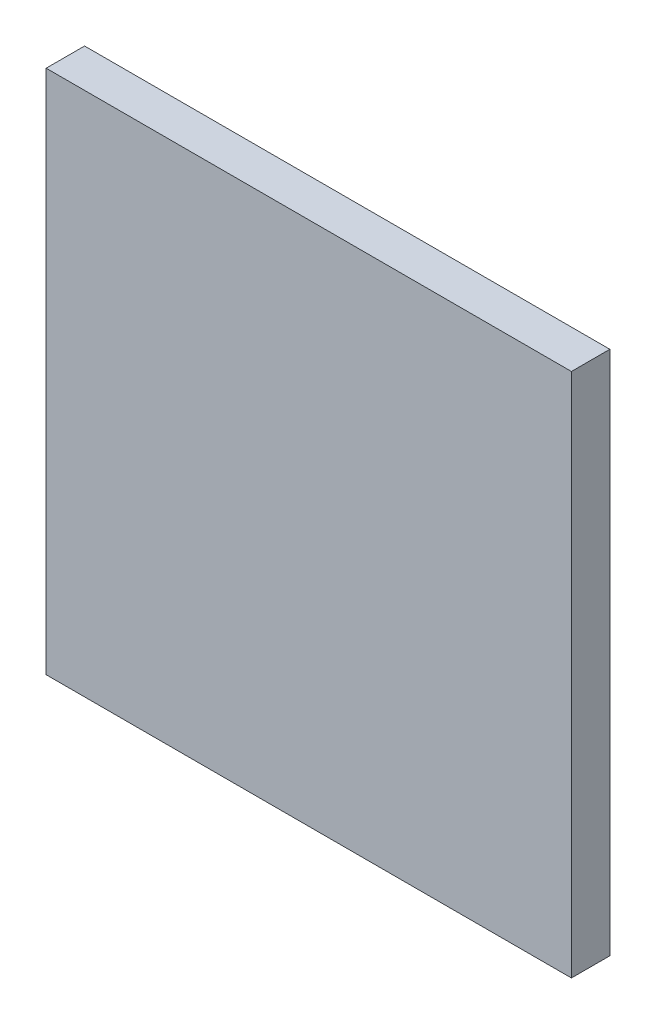
ISO-10303-21;
HEADER;
FILE_DESCRIPTION(('STEP AP214'),'2;1');
FILE_NAME('part.step','',(''),(''),'','','');
FILE_SCHEMA(('AUTOMOTIVE_DESIGN { 1 0 10303 214 1 1 1 1 }'));
ENDSEC;
DATA;
#1=APPLICATION_CONTEXT('core data for automotive mechanical design processes');
#2=APPLICATION_PROTOCOL_DEFINITION('international standard','automotive_design',2000,#1);
#3=PRODUCT_CONTEXT('',#1,'mechanical');
#4=PRODUCT('Part','Part','',(#3));
#5=PRODUCT_RELATED_PRODUCT_CATEGORY('part','',(#4));
#6=PRODUCT_DEFINITION_FORMATION('','',#4);
#7=PRODUCT_DEFINITION_CONTEXT('part definition',#1,'design');
#8=PRODUCT_DEFINITION('design','',#6,#7);
#9=PRODUCT_DEFINITION_SHAPE('','',#8);
#10=(LENGTH_UNIT() NAMED_UNIT(*) SI_UNIT(.MILLI.,.METRE.));
#11=(NAMED_UNIT(*) PLANE_ANGLE_UNIT() SI_UNIT($,.RADIAN.));
#12=(NAMED_UNIT(*) SI_UNIT($,.STERADIAN.) SOLID_ANGLE_UNIT());
#13=UNCERTAINTY_MEASURE_WITH_UNIT(LENGTH_MEASURE(1.E-05),#10,'distance_accuracy_value','');
#14=(GEOMETRIC_REPRESENTATION_CONTEXT(3) GLOBAL_UNCERTAINTY_ASSIGNED_CONTEXT((#13)) GLOBAL_UNIT_ASSIGNED_CONTEXT((#10,
#11,#12)) REPRESENTATION_CONTEXT('',''));
#15=CARTESIAN_POINT('',(0.,0.,0.));
#16=DIRECTION('',(0.,0.,1.));
#17=DIRECTION('',(1.,0.,0.));
#18=AXIS2_PLACEMENT_3D('',#15,#16,#17);
#19=CARTESIAN_POINT('',(0.,0.,0.));
#20=DIRECTION('',(0.,0.,1.));
#21=DIRECTION('',(1.,0.,0.));
#22=AXIS2_PLACEMENT_3D('',#19,#20,#21);
#23=PLANE('',#22);
#24=DIRECTION('',(0.,-1.,0.));
#25=VECTOR('',#24,1.);
#26=CARTESIAN_POINT('',(-154.745728399638,93.3447432762836,0.));
#27=LINE('',#26,#25);
#28=CARTESIAN_POINT('',(-154.745728399638,93.3447432762836,0.));
#29=VERTEX_POINT('',#28);
#30=CARTESIAN_POINT('',(-154.745728399638,-70.6552567237164,0.));
#31=VERTEX_POINT('',#30);
#32=EDGE_CURVE('E143',#29,#31,#27,.T.);
#33=ORIENTED_EDGE('',*,*,#32,.F.);
#34=DIRECTION('',(-1.,0.,0.));
#35=VECTOR('',#34,1.);
#36=CARTESIAN_POINT('',(-154.745728399638,93.3447432762836,0.));
#37=LINE('',#36,#35);
#38=CARTESIAN_POINT('',(9.2542716003621,93.3447432762836,0.));
#39=VERTEX_POINT('',#38);
#40=EDGE_CURVE('E91',#39,#29,#37,.T.);
#41=ORIENTED_EDGE('',*,*,#40,.F.);
#42=DIRECTION('',(0.,1.,0.));
#43=VECTOR('',#42,1.);
#44=CARTESIAN_POINT('',(9.2542716003621,93.3447432762836,0.));
#45=LINE('',#44,#43);
#46=CARTESIAN_POINT('',(9.25427160036213,-70.6552567237164,0.));
#47=VERTEX_POINT('',#46);
#48=EDGE_CURVE('E168',#47,#39,#45,.T.);
#49=ORIENTED_EDGE('',*,*,#48,.F.);
#50=DIRECTION('',(1.,0.,0.));
#51=VECTOR('',#50,1.);
#52=CARTESIAN_POINT('',(-154.745728399638,-70.6552567237164,0.));
#53=LINE('',#52,#51);
#54=EDGE_CURVE('E149',#31,#47,#53,.T.);
#55=ORIENTED_EDGE('',*,*,#54,.F.);
#56=EDGE_LOOP('',(#33,#41,#49,#55));
#57=FACE_BOUND('',#56,.T.);
#58=DIRECTION('',(0.,-1.,0.));
#59=VECTOR('',#58,1.);
#60=CARTESIAN_POINT('',(-152.745728399638,91.3447432762836,0.));
#61=LINE('',#60,#59);
#62=CARTESIAN_POINT('',(-152.745728399638,91.3447432762836,0.));
#63=VERTEX_POINT('',#62);
#64=CARTESIAN_POINT('',(-152.745728399638,-68.6552567237164,0.));
#65=VERTEX_POINT('',#64);
#66=EDGE_CURVE('E61',#63,#65,#61,.T.);
#67=ORIENTED_EDGE('',*,*,#66,.T.);
#68=DIRECTION('',(1.,0.,0.));
#69=VECTOR('',#68,1.);
#70=CARTESIAN_POINT('',(-152.745728399638,-68.6552567237164,0.));
#71=LINE('',#70,#69);
#72=CARTESIAN_POINT('',(7.25427160036213,-68.6552567237164,0.));
#73=VERTEX_POINT('',#72);
#74=EDGE_CURVE('E141',#65,#73,#71,.T.);
#75=ORIENTED_EDGE('',*,*,#74,.T.);
#76=DIRECTION('',(0.,1.,0.));
#77=VECTOR('',#76,1.);
#78=CARTESIAN_POINT('',(7.2542716003621,91.3447432762836,0.));
#79=LINE('',#78,#77);
#80=CARTESIAN_POINT('',(7.2542716003621,91.3447432762836,0.));
#81=VERTEX_POINT('',#80);
#82=EDGE_CURVE('E316',#73,#81,#79,.T.);
#83=ORIENTED_EDGE('',*,*,#82,.T.);
#84=DIRECTION('',(-1.,0.,0.));
#85=VECTOR('',#84,1.);
#86=CARTESIAN_POINT('',(-152.745728399638,91.3447432762836,0.));
#87=LINE('',#86,#85);
#88=EDGE_CURVE('E137',#81,#63,#87,.T.);
#89=ORIENTED_EDGE('',*,*,#88,.T.);
#90=EDGE_LOOP('',(#67,#75,#83,#89));
#91=FACE_BOUND('',#90,.T.);
#92=ADVANCED_FACE('F45',(#57,#91),#23,.F.);
#93=CARTESIAN_POINT('',(-154.745728399638,93.3447432762836,12.));
#94=DIRECTION('',(1.,0.,0.));
#95=DIRECTION('',(0.,1.,0.));
#96=AXIS2_PLACEMENT_3D('',#93,#94,#95);
#97=PLANE('',#96);
#98=ORIENTED_EDGE('',*,*,#32,.T.);
#99=DIRECTION('',(0.,0.,-1.));
#100=VECTOR('',#99,1.);
#101=CARTESIAN_POINT('',(-154.745728399638,-70.6552567237164,12.));
#102=LINE('',#101,#100);
#103=CARTESIAN_POINT('',(-154.745728399638,-70.6552567237164,12.));
#104=VERTEX_POINT('',#103);
#105=EDGE_CURVE('E11',#104,#31,#102,.T.);
#106=ORIENTED_EDGE('',*,*,#105,.F.);
#107=DIRECTION('',(0.,-1.,0.));
#108=VECTOR('',#107,1.);
#109=CARTESIAN_POINT('',(-154.745728399638,93.3447432762836,12.));
#110=LINE('',#109,#108);
#111=CARTESIAN_POINT('',(-154.745728399638,93.3447432762836,12.));
#112=VERTEX_POINT('',#111);
#113=EDGE_CURVE('E155',#112,#104,#110,.T.);
#114=ORIENTED_EDGE('',*,*,#113,.F.);
#115=DIRECTION('',(0.,0.,-1.));
#116=VECTOR('',#115,1.);
#117=CARTESIAN_POINT('',(-154.745728399638,93.3447432762836,12.));
#118=LINE('',#117,#116);
#119=EDGE_CURVE('E164',#112,#29,#118,.T.);
#120=ORIENTED_EDGE('',*,*,#119,.T.);
#121=EDGE_LOOP('',(#98,#106,#114,#120));
#122=FACE_BOUND('',#121,.T.);
#123=ADVANCED_FACE('F47',(#122),#97,.F.);
#124=CARTESIAN_POINT('',(-154.745728399638,-70.6552567237164,12.));
#125=DIRECTION('',(0.,1.,0.));
#126=DIRECTION('',(0.,0.,1.));
#127=AXIS2_PLACEMENT_3D('',#124,#125,#126);
#128=PLANE('',#127);
#129=ORIENTED_EDGE('',*,*,#54,.T.);
#130=DIRECTION('',(0.,0.,-1.));
#131=VECTOR('',#130,1.);
#132=CARTESIAN_POINT('',(9.25427160036213,-70.6552567237164,12.));
#133=LINE('',#132,#131);
#134=CARTESIAN_POINT('',(9.25427160036213,-70.6552567237164,12.));
#135=VERTEX_POINT('',#134);
#136=EDGE_CURVE('E54',#135,#47,#133,.T.);
#137=ORIENTED_EDGE('',*,*,#136,.F.);
#138=DIRECTION('',(1.,0.,0.));
#139=VECTOR('',#138,1.);
#140=CARTESIAN_POINT('',(-154.745728399638,-70.6552567237164,12.));
#141=LINE('',#140,#139);
#142=EDGE_CURVE('E98',#104,#135,#141,.T.);
#143=ORIENTED_EDGE('',*,*,#142,.F.);
#144=ORIENTED_EDGE('',*,*,#105,.T.);
#145=EDGE_LOOP('',(#129,#137,#143,#144));
#146=FACE_BOUND('',#145,.T.);
#147=ADVANCED_FACE('F199',(#146),#128,.F.);
#148=CARTESIAN_POINT('',(9.2542716003621,93.3447432762836,12.));
#149=DIRECTION('',(-1.,0.,0.));
#150=DIRECTION('',(0.,-1.,0.));
#151=AXIS2_PLACEMENT_3D('',#148,#149,#150);
#152=PLANE('',#151);
#153=ORIENTED_EDGE('',*,*,#48,.T.);
#154=DIRECTION('',(0.,0.,-1.));
#155=VECTOR('',#154,1.);
#156=CARTESIAN_POINT('',(9.2542716003621,93.3447432762836,12.));
#157=LINE('',#156,#155);
#158=CARTESIAN_POINT('',(9.2542716003621,93.3447432762836,12.));
#159=VERTEX_POINT('',#158);
#160=EDGE_CURVE('E175',#159,#39,#157,.T.);
#161=ORIENTED_EDGE('',*,*,#160,.F.);
#162=DIRECTION('',(0.,1.,0.));
#163=VECTOR('',#162,1.);
#164=CARTESIAN_POINT('',(9.2542716003621,93.3447432762836,12.));
#165=LINE('',#164,#163);
#166=EDGE_CURVE('E160',#135,#159,#165,.T.);
#167=ORIENTED_EDGE('',*,*,#166,.F.);
#168=ORIENTED_EDGE('',*,*,#136,.T.);
#169=EDGE_LOOP('',(#153,#161,#167,#168));
#170=FACE_BOUND('',#169,.T.);
#171=ADVANCED_FACE('F182',(#170),#152,.F.);
#172=CARTESIAN_POINT('',(-154.745728399638,93.3447432762836,12.));
#173=DIRECTION('',(0.,-1.,0.));
#174=DIRECTION('',(0.,0.,-1.));
#175=AXIS2_PLACEMENT_3D('',#172,#173,#174);
#176=PLANE('',#175);
#177=ORIENTED_EDGE('',*,*,#40,.T.);
#178=ORIENTED_EDGE('',*,*,#119,.F.);
#179=DIRECTION('',(-1.,0.,0.));
#180=VECTOR('',#179,1.);
#181=CARTESIAN_POINT('',(-154.745728399638,93.3447432762836,12.));
#182=LINE('',#181,#180);
#183=EDGE_CURVE('E70',#159,#112,#182,.T.);
#184=ORIENTED_EDGE('',*,*,#183,.F.);
#185=ORIENTED_EDGE('',*,*,#160,.T.);
#186=EDGE_LOOP('',(#177,#178,#184,#185));
#187=FACE_BOUND('',#186,.T.);
#188=ADVANCED_FACE('F190',(#187),#176,.F.);
#189=CARTESIAN_POINT('',(0.,0.,12.));
#190=DIRECTION('',(0.,0.,1.));
#191=DIRECTION('',(1.,0.,0.));
#192=AXIS2_PLACEMENT_3D('',#189,#190,#191);
#193=PLANE('',#192);
#194=ORIENTED_EDGE('',*,*,#113,.T.);
#195=ORIENTED_EDGE('',*,*,#142,.T.);
#196=ORIENTED_EDGE('',*,*,#166,.T.);
#197=ORIENTED_EDGE('',*,*,#183,.T.);
#198=EDGE_LOOP('',(#194,#195,#196,#197));
#199=FACE_BOUND('',#198,.T.);
#200=ADVANCED_FACE('F192',(#199),#193,.T.);
#201=CARTESIAN_POINT('',(-152.745728399638,91.3447432762836,10.));
#202=DIRECTION('',(1.,0.,0.));
#203=DIRECTION('',(0.,0.,-1.));
#204=AXIS2_PLACEMENT_3D('',#201,#202,#203);
#205=PLANE('',#204);
#206=ORIENTED_EDGE('',*,*,#66,.F.);
#207=DIRECTION('',(0.,0.,-1.));
#208=VECTOR('',#207,1.);
#209=CARTESIAN_POINT('',(-152.745728399638,91.3447432762836,10.));
#210=LINE('',#209,#208);
#211=CARTESIAN_POINT('',(-152.745728399638,91.3447432762836,10.));
#212=VERTEX_POINT('',#211);
#213=EDGE_CURVE('E135',#212,#63,#210,.T.);
#214=ORIENTED_EDGE('',*,*,#213,.F.);
#215=DIRECTION('',(0.,-1.,0.));
#216=VECTOR('',#215,1.);
#217=CARTESIAN_POINT('',(-152.745728399638,91.3447432762836,10.));
#218=LINE('',#217,#216);
#219=CARTESIAN_POINT('',(-152.745728399638,-68.6552567237164,10.));
#220=VERTEX_POINT('',#219);
#221=EDGE_CURVE('E126',#212,#220,#218,.T.);
#222=ORIENTED_EDGE('',*,*,#221,.T.);
#223=DIRECTION('',(0.,0.,-1.));
#224=VECTOR('',#223,1.);
#225=CARTESIAN_POINT('',(-152.745728399638,-68.6552567237164,10.));
#226=LINE('',#225,#224);
#227=EDGE_CURVE('E134',#220,#65,#226,.T.);
#228=ORIENTED_EDGE('',*,*,#227,.T.);
#229=EDGE_LOOP('',(#206,#214,#222,#228));
#230=FACE_BOUND('',#229,.T.);
#231=ADVANCED_FACE('F133',(#230),#205,.T.);
#232=CARTESIAN_POINT('',(-152.745728399638,-68.6552567237164,10.));
#233=DIRECTION('',(0.,1.,0.));
#234=DIRECTION('',(0.,0.,1.));
#235=AXIS2_PLACEMENT_3D('',#232,#233,#234);
#236=PLANE('',#235);
#237=ORIENTED_EDGE('',*,*,#74,.F.);
#238=ORIENTED_EDGE('',*,*,#227,.F.);
#239=DIRECTION('',(1.,0.,0.));
#240=VECTOR('',#239,1.);
#241=CARTESIAN_POINT('',(-152.745728399638,-68.6552567237164,10.));
#242=LINE('',#241,#240);
#243=CARTESIAN_POINT('',(7.25427160036213,-68.6552567237164,10.));
#244=VERTEX_POINT('',#243);
#245=EDGE_CURVE('E122',#220,#244,#242,.T.);
#246=ORIENTED_EDGE('',*,*,#245,.T.);
#247=DIRECTION('',(0.,0.,-1.));
#248=VECTOR('',#247,1.);
#249=CARTESIAN_POINT('',(7.25427160036213,-68.6552567237164,10.));
#250=LINE('',#249,#248);
#251=EDGE_CURVE('E144',#244,#73,#250,.T.);
#252=ORIENTED_EDGE('',*,*,#251,.T.);
#253=EDGE_LOOP('',(#237,#238,#246,#252));
#254=FACE_BOUND('',#253,.T.);
#255=ADVANCED_FACE('F139',(#254),#236,.T.);
#256=CARTESIAN_POINT('',(7.2542716003621,91.3447432762836,10.));
#257=DIRECTION('',(-1.,0.,0.));
#258=DIRECTION('',(0.,-1.,0.));
#259=AXIS2_PLACEMENT_3D('',#256,#257,#258);
#260=PLANE('',#259);
#261=ORIENTED_EDGE('',*,*,#82,.F.);
#262=ORIENTED_EDGE('',*,*,#251,.F.);
#263=DIRECTION('',(0.,1.,0.));
#264=VECTOR('',#263,1.);
#265=CARTESIAN_POINT('',(7.2542716003621,91.3447432762836,10.));
#266=LINE('',#265,#264);
#267=CARTESIAN_POINT('',(7.2542716003621,91.3447432762836,10.));
#268=VERTEX_POINT('',#267);
#269=EDGE_CURVE('E127',#244,#268,#266,.T.);
#270=ORIENTED_EDGE('',*,*,#269,.T.);
#271=DIRECTION('',(0.,0.,-1.));
#272=VECTOR('',#271,1.);
#273=CARTESIAN_POINT('',(7.2542716003621,91.3447432762836,10.));
#274=LINE('',#273,#272);
#275=EDGE_CURVE('E151',#268,#81,#274,.T.);
#276=ORIENTED_EDGE('',*,*,#275,.T.);
#277=EDGE_LOOP('',(#261,#262,#270,#276));
#278=FACE_BOUND('',#277,.T.);
#279=ADVANCED_FACE('F211',(#278),#260,.T.);
#280=CARTESIAN_POINT('',(-152.745728399638,91.3447432762836,10.));
#281=DIRECTION('',(0.,-1.,0.));
#282=DIRECTION('',(0.,0.,-1.));
#283=AXIS2_PLACEMENT_3D('',#280,#281,#282);
#284=PLANE('',#283);
#285=ORIENTED_EDGE('',*,*,#88,.F.);
#286=ORIENTED_EDGE('',*,*,#275,.F.);
#287=DIRECTION('',(-1.,0.,0.));
#288=VECTOR('',#287,1.);
#289=CARTESIAN_POINT('',(-152.745728399638,91.3447432762836,10.));
#290=LINE('',#289,#288);
#291=EDGE_CURVE('E326',#268,#212,#290,.T.);
#292=ORIENTED_EDGE('',*,*,#291,.T.);
#293=ORIENTED_EDGE('',*,*,#213,.T.);
#294=EDGE_LOOP('',(#285,#286,#292,#293));
#295=FACE_BOUND('',#294,.T.);
#296=ADVANCED_FACE('F214',(#295),#284,.T.);
#297=CARTESIAN_POINT('',(0.,0.,10.));
#298=DIRECTION('',(0.,0.,1.));
#299=DIRECTION('',(1.,0.,0.));
#300=AXIS2_PLACEMENT_3D('',#297,#298,#299);
#301=PLANE('',#300);
#302=ORIENTED_EDGE('',*,*,#221,.F.);
#303=ORIENTED_EDGE('',*,*,#291,.F.);
#304=ORIENTED_EDGE('',*,*,#269,.F.);
#305=ORIENTED_EDGE('',*,*,#245,.F.);
#306=EDGE_LOOP('',(#302,#303,#304,#305));
#307=FACE_BOUND('',#306,.T.);
#308=ADVANCED_FACE('F124',(#307),#301,.F.);
#309=CLOSED_SHELL('',(#92,#123,#147,#171,#188,#200,#231,#255,#279,#296,#308));
#310=MANIFOLD_SOLID_BREP('B2',#309);
#311=ADVANCED_BREP_SHAPE_REPRESENTATION('',(#18,#310),#14);
#312=SHAPE_DEFINITION_REPRESENTATION(#9,#311);
ENDSEC;
END-ISO-10303-21;
